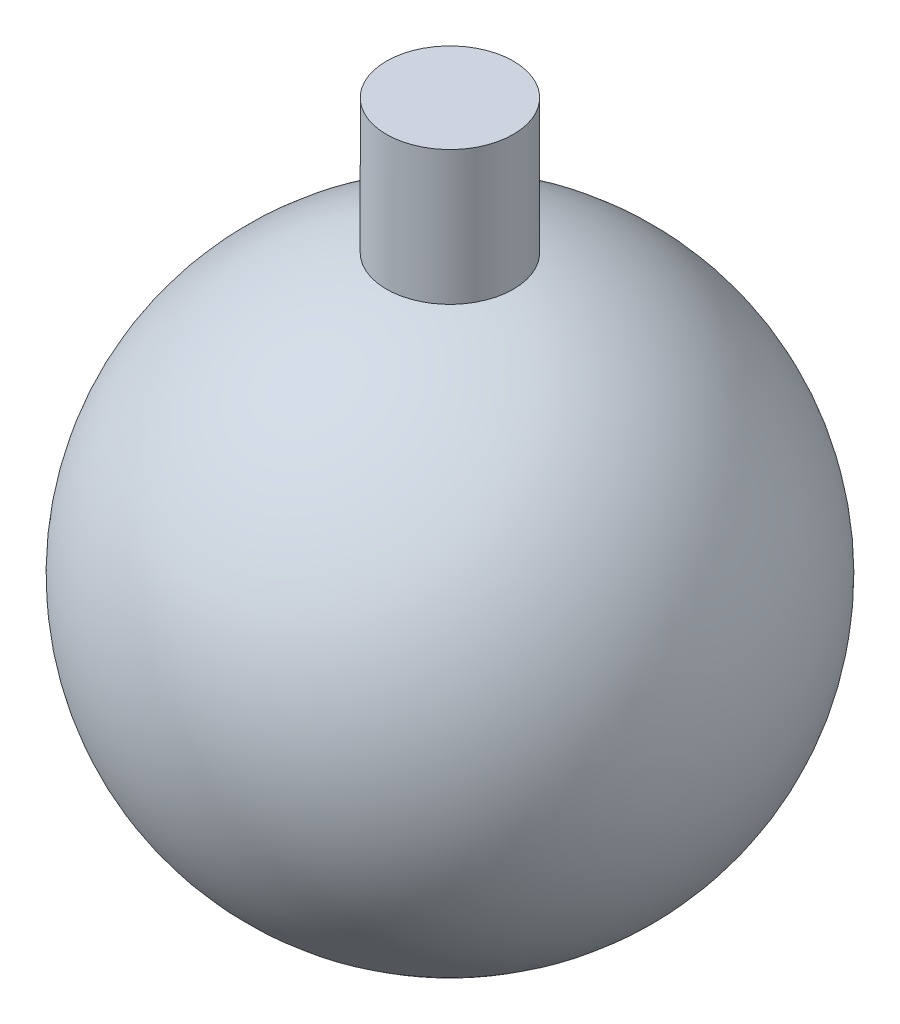
ISO-10303-21;
HEADER;
FILE_DESCRIPTION(('STEP AP214'),'2;1');
FILE_NAME('part.step','',(''),(''),'','','');
FILE_SCHEMA(('AUTOMOTIVE_DESIGN { 1 0 10303 214 1 1 1 1 }'));
ENDSEC;
DATA;
#1=APPLICATION_CONTEXT('core data for automotive mechanical design processes');
#2=APPLICATION_PROTOCOL_DEFINITION('international standard','automotive_design',2000,#1);
#3=PRODUCT_CONTEXT('',#1,'mechanical');
#4=PRODUCT('Part','Part','',(#3));
#5=PRODUCT_RELATED_PRODUCT_CATEGORY('part','',(#4));
#6=PRODUCT_DEFINITION_FORMATION('','',#4);
#7=PRODUCT_DEFINITION_CONTEXT('part definition',#1,'design');
#8=PRODUCT_DEFINITION('design','',#6,#7);
#9=PRODUCT_DEFINITION_SHAPE('','',#8);
#10=(LENGTH_UNIT() NAMED_UNIT(*) SI_UNIT(.MILLI.,.METRE.));
#11=(NAMED_UNIT(*) PLANE_ANGLE_UNIT() SI_UNIT($,.RADIAN.));
#12=(NAMED_UNIT(*) SI_UNIT($,.STERADIAN.) SOLID_ANGLE_UNIT());
#13=UNCERTAINTY_MEASURE_WITH_UNIT(LENGTH_MEASURE(1.E-05),#10,'distance_accuracy_value','');
#14=(GEOMETRIC_REPRESENTATION_CONTEXT(3) GLOBAL_UNCERTAINTY_ASSIGNED_CONTEXT((#13)) GLOBAL_UNIT_ASSIGNED_CONTEXT((#10,
#11,#12)) REPRESENTATION_CONTEXT('',''));
#15=CARTESIAN_POINT('',(0.,0.,0.));
#16=DIRECTION('',(0.,0.,1.));
#17=DIRECTION('',(1.,0.,0.));
#18=AXIS2_PLACEMENT_3D('',#15,#16,#17);
#19=CARTESIAN_POINT('',(0.,13.,0.));
#20=DIRECTION('',(0.,-1.,0.));
#21=DIRECTION('',(0.,0.,-1.));
#22=AXIS2_PLACEMENT_3D('',#19,#20,#21);
#23=CYLINDRICAL_SURFACE('',#22,2.);
#24=CARTESIAN_POINT('',(0.,8.77496438739212,0.));
#25=DIRECTION('',(0.,-1.,0.));
#26=DIRECTION('',(0.,0.,-1.));
#27=AXIS2_PLACEMENT_3D('',#24,#25,#26);
#28=CIRCLE('',#27,2.);
#29=CARTESIAN_POINT('',(0.,8.77496438739212,-2.));
#30=VERTEX_POINT('',#29);
#31=EDGE_CURVE('E10',#30,#30,#28,.T.);
#32=ORIENTED_EDGE('',*,*,#31,.F.);
#33=EDGE_LOOP('',(#32));
#34=FACE_BOUND('',#33,.T.);
#35=CARTESIAN_POINT('',(0.,13.,0.));
#36=DIRECTION('',(0.,1.,0.));
#37=DIRECTION('',(0.,0.,1.));
#38=AXIS2_PLACEMENT_3D('',#35,#36,#37);
#39=CIRCLE('',#38,2.);
#40=CARTESIAN_POINT('',(0.,13.,2.));
#41=VERTEX_POINT('',#40);
#42=EDGE_CURVE('E49',#41,#41,#39,.T.);
#43=ORIENTED_EDGE('',*,*,#42,.F.);
#44=EDGE_LOOP('',(#43));
#45=FACE_BOUND('',#44,.T.);
#46=ADVANCED_FACE('F41',(#34,#45),#23,.T.);
#47=CARTESIAN_POINT('',(0.,13.,0.));
#48=DIRECTION('',(0.,1.,0.));
#49=DIRECTION('',(0.,0.,1.));
#50=AXIS2_PLACEMENT_3D('',#47,#48,#49);
#51=PLANE('',#50);
#52=ORIENTED_EDGE('',*,*,#42,.T.);
#53=EDGE_LOOP('',(#52));
#54=FACE_BOUND('',#53,.T.);
#55=ADVANCED_FACE('F56',(#54),#51,.T.);
#56=CARTESIAN_POINT('',(0.,0.,0.));
#57=DIRECTION('',(0.,1.,0.));
#58=DIRECTION('',(1.,0.,0.));
#59=AXIS2_PLACEMENT_3D('',#56,#57,#58);
#60=SPHERICAL_SURFACE('',#59,9.);
#61=ORIENTED_EDGE('',*,*,#31,.T.);
#62=EDGE_LOOP('',(#61));
#63=FACE_BOUND('',#62,.T.);
#64=ADVANCED_FACE('F43',(#63),#60,.T.);
#65=CLOSED_SHELL('',(#46,#55,#64));
#66=MANIFOLD_SOLID_BREP('B2',#65);
#67=ADVANCED_BREP_SHAPE_REPRESENTATION('',(#18,#66),#14);
#68=SHAPE_DEFINITION_REPRESENTATION(#9,#67);
ENDSEC;
END-ISO-10303-21;
